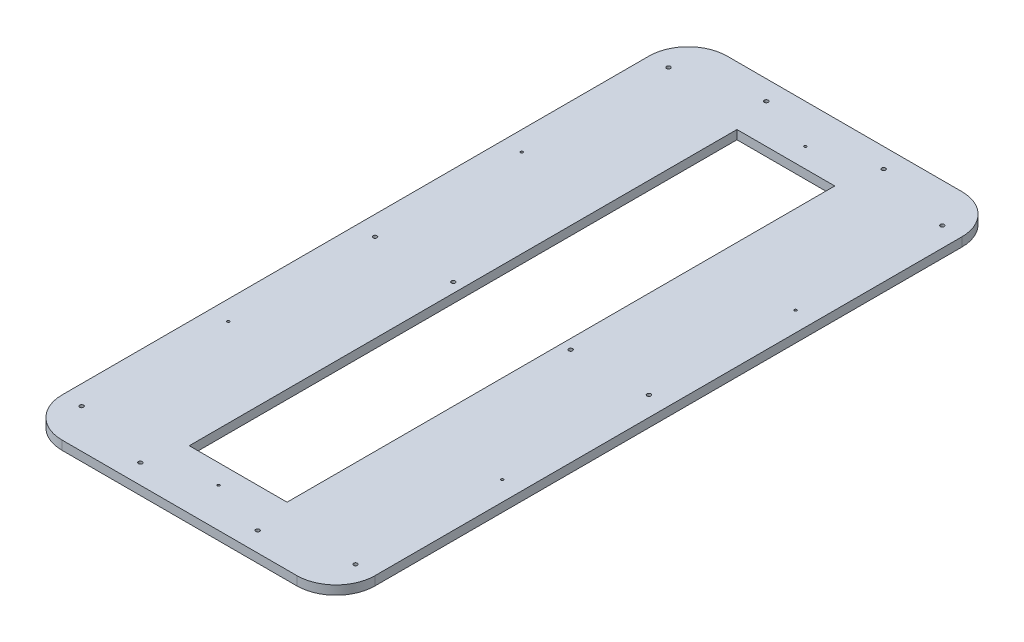
ISO-10303-21;
HEADER;
FILE_DESCRIPTION(('STEP AP214'),'2;1');
FILE_NAME('part.step','',(''),(''),'','','');
FILE_SCHEMA(('AUTOMOTIVE_DESIGN { 1 0 10303 214 1 1 1 1 }'));
ENDSEC;
DATA;
#1=APPLICATION_CONTEXT('core data for automotive mechanical design processes');
#2=APPLICATION_PROTOCOL_DEFINITION('international standard','automotive_design',2000,#1);
#3=PRODUCT_CONTEXT('',#1,'mechanical');
#4=PRODUCT('Part','Part','',(#3));
#5=PRODUCT_RELATED_PRODUCT_CATEGORY('part','',(#4));
#6=PRODUCT_DEFINITION_FORMATION('','',#4);
#7=PRODUCT_DEFINITION_CONTEXT('part definition',#1,'design');
#8=PRODUCT_DEFINITION('design','',#6,#7);
#9=PRODUCT_DEFINITION_SHAPE('','',#8);
#10=(LENGTH_UNIT() NAMED_UNIT(*) SI_UNIT(.MILLI.,.METRE.));
#11=(NAMED_UNIT(*) PLANE_ANGLE_UNIT() SI_UNIT($,.RADIAN.));
#12=(NAMED_UNIT(*) SI_UNIT($,.STERADIAN.) SOLID_ANGLE_UNIT());
#13=UNCERTAINTY_MEASURE_WITH_UNIT(LENGTH_MEASURE(1.E-05),#10,'distance_accuracy_value','');
#14=(GEOMETRIC_REPRESENTATION_CONTEXT(3) GLOBAL_UNCERTAINTY_ASSIGNED_CONTEXT((#13)) GLOBAL_UNIT_ASSIGNED_CONTEXT((#10,
#11,#12)) REPRESENTATION_CONTEXT('',''));
#15=CARTESIAN_POINT('',(0.,0.,0.));
#16=DIRECTION('',(0.,0.,1.));
#17=DIRECTION('',(1.,0.,0.));
#18=AXIS2_PLACEMENT_3D('',#15,#16,#17);
#19=CARTESIAN_POINT('',(0.,5.8,0.));
#20=DIRECTION('',(1.,0.,0.));
#21=DIRECTION('',(0.,0.,-1.));
#22=AXIS2_PLACEMENT_3D('',#19,#20,#21);
#23=PLANE('',#22);
#24=DIRECTION('',(0.,0.,1.));
#25=VECTOR('',#24,1.);
#26=CARTESIAN_POINT('',(0.,5.8,0.));
#27=LINE('',#26,#25);
#28=CARTESIAN_POINT('',(0.,5.8,-406.4));
#29=VERTEX_POINT('',#28);
#30=CARTESIAN_POINT('',(0.,5.8,-25.4));
#31=VERTEX_POINT('',#30);
#32=EDGE_CURVE('E197',#29,#31,#27,.T.);
#33=ORIENTED_EDGE('',*,*,#32,.F.);
#34=DIRECTION('',(0.,-1.,0.));
#35=VECTOR('',#34,1.);
#36=CARTESIAN_POINT('',(0.,5.8,-406.4));
#37=LINE('',#36,#35);
#38=CARTESIAN_POINT('',(0.,0.,-406.4));
#39=VERTEX_POINT('',#38);
#40=EDGE_CURVE('E254',#29,#39,#37,.T.);
#41=ORIENTED_EDGE('',*,*,#40,.T.);
#42=DIRECTION('',(0.,0.,1.));
#43=VECTOR('',#42,1.);
#44=CARTESIAN_POINT('',(0.,0.,0.));
#45=LINE('',#44,#43);
#46=CARTESIAN_POINT('',(0.,0.,-25.4));
#47=VERTEX_POINT('',#46);
#48=EDGE_CURVE('E196',#39,#47,#45,.T.);
#49=ORIENTED_EDGE('',*,*,#48,.T.);
#50=DIRECTION('',(0.,-1.,0.));
#51=VECTOR('',#50,1.);
#52=CARTESIAN_POINT('',(0.,5.8,-25.4));
#53=LINE('',#52,#51);
#54=EDGE_CURVE('E252',#47,#31,#53,.F.);
#55=ORIENTED_EDGE('',*,*,#54,.T.);
#56=EDGE_LOOP('',(#33,#41,#49,#55));
#57=FACE_BOUND('',#56,.T.);
#58=ADVANCED_FACE('F32',(#57),#23,.F.);
#59=CARTESIAN_POINT('',(0.,5.8,0.));
#60=DIRECTION('',(0.,0.,-1.));
#61=DIRECTION('',(-1.,0.,0.));
#62=AXIS2_PLACEMENT_3D('',#59,#60,#61);
#63=PLANE('',#62);
#64=DIRECTION('',(1.,0.,0.));
#65=VECTOR('',#64,1.);
#66=CARTESIAN_POINT('',(0.,0.,0.));
#67=LINE('',#66,#65);
#68=CARTESIAN_POINT('',(25.4,0.,0.));
#69=VERTEX_POINT('',#68);
#70=CARTESIAN_POINT('',(177.8,0.,0.));
#71=VERTEX_POINT('',#70);
#72=EDGE_CURVE('E211',#69,#71,#67,.T.);
#73=ORIENTED_EDGE('',*,*,#72,.T.);
#74=DIRECTION('',(0.,-1.,0.));
#75=VECTOR('',#74,1.);
#76=CARTESIAN_POINT('',(177.8,5.8,0.));
#77=LINE('',#76,#75);
#78=CARTESIAN_POINT('',(177.8,5.8,0.));
#79=VERTEX_POINT('',#78);
#80=EDGE_CURVE('E11',#71,#79,#77,.F.);
#81=ORIENTED_EDGE('',*,*,#80,.T.);
#82=DIRECTION('',(1.,0.,0.));
#83=VECTOR('',#82,1.);
#84=CARTESIAN_POINT('',(0.,5.8,0.));
#85=LINE('',#84,#83);
#86=CARTESIAN_POINT('',(25.4,5.8,0.));
#87=VERTEX_POINT('',#86);
#88=EDGE_CURVE('E199',#87,#79,#85,.T.);
#89=ORIENTED_EDGE('',*,*,#88,.F.);
#90=DIRECTION('',(0.,-1.,0.));
#91=VECTOR('',#90,1.);
#92=CARTESIAN_POINT('',(25.4,5.8,0.));
#93=LINE('',#92,#91);
#94=EDGE_CURVE('E41',#87,#69,#93,.T.);
#95=ORIENTED_EDGE('',*,*,#94,.T.);
#96=EDGE_LOOP('',(#73,#81,#89,#95));
#97=FACE_BOUND('',#96,.T.);
#98=ADVANCED_FACE('F342',(#97),#63,.F.);
#99=CARTESIAN_POINT('',(203.2,5.8,0.));
#100=DIRECTION('',(-1.,0.,0.));
#101=DIRECTION('',(0.,0.,1.));
#102=AXIS2_PLACEMENT_3D('',#99,#100,#101);
#103=PLANE('',#102);
#104=DIRECTION('',(0.,0.,-1.));
#105=VECTOR('',#104,1.);
#106=CARTESIAN_POINT('',(203.2,0.,0.));
#107=LINE('',#106,#105);
#108=CARTESIAN_POINT('',(203.2,0.,-25.4));
#109=VERTEX_POINT('',#108);
#110=CARTESIAN_POINT('',(203.2,0.,-406.4));
#111=VERTEX_POINT('',#110);
#112=EDGE_CURVE('E213',#109,#111,#107,.T.);
#113=ORIENTED_EDGE('',*,*,#112,.T.);
#114=DIRECTION('',(0.,-1.,0.));
#115=VECTOR('',#114,1.);
#116=CARTESIAN_POINT('',(203.2,5.8,-406.4));
#117=LINE('',#116,#115);
#118=CARTESIAN_POINT('',(203.2,5.8,-406.4));
#119=VERTEX_POINT('',#118);
#120=EDGE_CURVE('E243',#111,#119,#117,.F.);
#121=ORIENTED_EDGE('',*,*,#120,.T.);
#122=DIRECTION('',(0.,0.,-1.));
#123=VECTOR('',#122,1.);
#124=CARTESIAN_POINT('',(203.2,5.8,0.));
#125=LINE('',#124,#123);
#126=CARTESIAN_POINT('',(203.2,5.8,-25.4));
#127=VERTEX_POINT('',#126);
#128=EDGE_CURVE('E202',#127,#119,#125,.T.);
#129=ORIENTED_EDGE('',*,*,#128,.F.);
#130=DIRECTION('',(0.,-1.,0.));
#131=VECTOR('',#130,1.);
#132=CARTESIAN_POINT('',(203.2,5.8,-25.4));
#133=LINE('',#132,#131);
#134=EDGE_CURVE('E240',#127,#109,#133,.T.);
#135=ORIENTED_EDGE('',*,*,#134,.T.);
#136=EDGE_LOOP('',(#113,#121,#129,#135));
#137=FACE_BOUND('',#136,.T.);
#138=ADVANCED_FACE('F345',(#137),#103,.F.);
#139=CARTESIAN_POINT('',(0.,5.8,-431.8));
#140=DIRECTION('',(0.,0.,1.));
#141=DIRECTION('',(1.,0.,0.));
#142=AXIS2_PLACEMENT_3D('',#139,#140,#141);
#143=PLANE('',#142);
#144=DIRECTION('',(-1.,0.,0.));
#145=VECTOR('',#144,1.);
#146=CARTESIAN_POINT('',(0.,5.8,-431.8));
#147=LINE('',#146,#145);
#148=CARTESIAN_POINT('',(177.8,5.8,-431.8));
#149=VERTEX_POINT('',#148);
#150=CARTESIAN_POINT('',(25.4,5.8,-431.8));
#151=VERTEX_POINT('',#150);
#152=EDGE_CURVE('E205',#149,#151,#147,.T.);
#153=ORIENTED_EDGE('',*,*,#152,.F.);
#154=DIRECTION('',(0.,-1.,0.));
#155=VECTOR('',#154,1.);
#156=CARTESIAN_POINT('',(177.8,5.8,-431.8));
#157=LINE('',#156,#155);
#158=CARTESIAN_POINT('',(177.8,0.,-431.8));
#159=VERTEX_POINT('',#158);
#160=EDGE_CURVE('E229',#149,#159,#157,.T.);
#161=ORIENTED_EDGE('',*,*,#160,.T.);
#162=DIRECTION('',(-1.,0.,0.));
#163=VECTOR('',#162,1.);
#164=CARTESIAN_POINT('',(0.,0.,-431.8));
#165=LINE('',#164,#163);
#166=CARTESIAN_POINT('',(25.4,0.,-431.8));
#167=VERTEX_POINT('',#166);
#168=EDGE_CURVE('E200',#159,#167,#165,.T.);
#169=ORIENTED_EDGE('',*,*,#168,.T.);
#170=DIRECTION('',(0.,-1.,0.));
#171=VECTOR('',#170,1.);
#172=CARTESIAN_POINT('',(25.4,5.8,-431.8));
#173=LINE('',#172,#171);
#174=EDGE_CURVE('E208',#167,#151,#173,.F.);
#175=ORIENTED_EDGE('',*,*,#174,.T.);
#176=EDGE_LOOP('',(#153,#161,#169,#175));
#177=FACE_BOUND('',#176,.T.);
#178=ADVANCED_FACE('F297',(#177),#143,.F.);
#179=CARTESIAN_POINT('',(0.,5.8,-431.8));
#180=DIRECTION('',(0.,-1.,0.));
#181=DIRECTION('',(0.,0.,-1.));
#182=AXIS2_PLACEMENT_3D('',#179,#180,#181);
#183=PLANE('',#182);
#184=CARTESIAN_POINT('',(12.7,5.8,-120.65));
#185=DIRECTION('',(0.,1.,0.));
#186=DIRECTION('',(0.,0.,-1.));
#187=AXIS2_PLACEMENT_3D('',#184,#185,#186);
#188=CIRCLE('',#187,0.793750000000006);
#189=CARTESIAN_POINT('',(12.7,5.8,-121.44375));
#190=VERTEX_POINT('',#189);
#191=EDGE_CURVE('E502',#190,#190,#188,.T.);
#192=ORIENTED_EDGE('',*,*,#191,.F.);
#193=EDGE_LOOP('',(#192));
#194=FACE_BOUND('',#193,.T.);
#195=CARTESIAN_POINT('',(190.5,5.8,-120.65));
#196=DIRECTION('',(0.,1.,0.));
#197=DIRECTION('',(0.,0.,-1.));
#198=AXIS2_PLACEMENT_3D('',#195,#196,#197);
#199=CIRCLE('',#198,0.79375000000005);
#200=CARTESIAN_POINT('',(190.5,5.8,-121.44375));
#201=VERTEX_POINT('',#200);
#202=EDGE_CURVE('E504',#201,#201,#199,.T.);
#203=ORIENTED_EDGE('',*,*,#202,.F.);
#204=EDGE_LOOP('',(#203));
#205=FACE_BOUND('',#204,.T.);
#206=CARTESIAN_POINT('',(101.6,5.8,-25.3999999999998));
#207=DIRECTION('',(0.,1.,0.));
#208=DIRECTION('',(0.,0.,-1.));
#209=AXIS2_PLACEMENT_3D('',#206,#207,#208);
#210=CIRCLE('',#209,0.793749999999978);
#211=CARTESIAN_POINT('',(101.6,5.8,-26.1937499999998));
#212=VERTEX_POINT('',#211);
#213=EDGE_CURVE('E508',#212,#212,#210,.T.);
#214=ORIENTED_EDGE('',*,*,#213,.F.);
#215=EDGE_LOOP('',(#214));
#216=FACE_BOUND('',#215,.T.);
#217=CARTESIAN_POINT('',(101.6,5.8,-406.4));
#218=DIRECTION('',(0.,1.,0.));
#219=DIRECTION('',(0.,0.,1.));
#220=AXIS2_PLACEMENT_3D('',#217,#218,#219);
#221=CIRCLE('',#220,0.793749999999971);
#222=CARTESIAN_POINT('',(101.6,5.8,-405.60625));
#223=VERTEX_POINT('',#222);
#224=EDGE_CURVE('E512',#223,#223,#221,.T.);
#225=ORIENTED_EDGE('',*,*,#224,.F.);
#226=EDGE_LOOP('',(#225));
#227=FACE_BOUND('',#226,.T.);
#228=CARTESIAN_POINT('',(190.5,5.8,-311.15));
#229=DIRECTION('',(0.,1.,0.));
#230=DIRECTION('',(0.,0.,1.));
#231=AXIS2_PLACEMENT_3D('',#228,#229,#230);
#232=CIRCLE('',#231,0.79375000000008);
#233=CARTESIAN_POINT('',(190.5,5.8,-310.35625));
#234=VERTEX_POINT('',#233);
#235=EDGE_CURVE('E516',#234,#234,#232,.T.);
#236=ORIENTED_EDGE('',*,*,#235,.F.);
#237=EDGE_LOOP('',(#236));
#238=FACE_BOUND('',#237,.T.);
#239=CARTESIAN_POINT('',(12.7,5.8,-311.15));
#240=DIRECTION('',(0.,1.,0.));
#241=DIRECTION('',(0.,0.,1.));
#242=AXIS2_PLACEMENT_3D('',#239,#240,#241);
#243=CIRCLE('',#242,0.793750000000026);
#244=CARTESIAN_POINT('',(12.7,5.8,-310.35625));
#245=VERTEX_POINT('',#244);
#246=EDGE_CURVE('E520',#245,#245,#243,.T.);
#247=ORIENTED_EDGE('',*,*,#246,.F.);
#248=EDGE_LOOP('',(#247));
#249=FACE_BOUND('',#248,.T.);
#250=CARTESIAN_POINT('',(190.5,5.8,-406.4));
#251=DIRECTION('',(0.,1.,0.));
#252=DIRECTION('',(0.,0.,1.));
#253=AXIS2_PLACEMENT_3D('',#250,#251,#252);
#254=CIRCLE('',#253,1.25);
#255=CARTESIAN_POINT('',(190.5,5.8,-405.15));
#256=VERTEX_POINT('',#255);
#257=EDGE_CURVE('E284',#256,#256,#254,.T.);
#258=ORIENTED_EDGE('',*,*,#257,.F.);
#259=EDGE_LOOP('',(#258));
#260=FACE_BOUND('',#259,.T.);
#261=CARTESIAN_POINT('',(190.5,5.8,-25.4));
#262=DIRECTION('',(0.,1.,0.));
#263=DIRECTION('',(0.,0.,1.));
#264=AXIS2_PLACEMENT_3D('',#261,#262,#263);
#265=CIRCLE('',#264,1.25);
#266=CARTESIAN_POINT('',(190.5,5.8,-24.15));
#267=VERTEX_POINT('',#266);
#268=EDGE_CURVE('E274',#267,#267,#265,.T.);
#269=ORIENTED_EDGE('',*,*,#268,.F.);
#270=EDGE_LOOP('',(#269));
#271=FACE_BOUND('',#270,.T.);
#272=CARTESIAN_POINT('',(12.7,5.8,-25.4));
#273=DIRECTION('',(0.,1.,0.));
#274=DIRECTION('',(0.,0.,1.));
#275=AXIS2_PLACEMENT_3D('',#272,#273,#274);
#276=CIRCLE('',#275,1.25);
#277=CARTESIAN_POINT('',(12.7,5.8,-24.15));
#278=VERTEX_POINT('',#277);
#279=EDGE_CURVE('E271',#278,#278,#276,.T.);
#280=ORIENTED_EDGE('',*,*,#279,.F.);
#281=EDGE_LOOP('',(#280));
#282=FACE_BOUND('',#281,.T.);
#283=CARTESIAN_POINT('',(12.7,5.8,-406.4));
#284=DIRECTION('',(0.,1.,0.));
#285=DIRECTION('',(0.,0.,1.));
#286=AXIS2_PLACEMENT_3D('',#283,#284,#285);
#287=CIRCLE('',#286,1.25);
#288=CARTESIAN_POINT('',(12.7,5.8,-405.15));
#289=VERTEX_POINT('',#288);
#290=EDGE_CURVE('E268',#289,#289,#287,.T.);
#291=ORIENTED_EDGE('',*,*,#290,.F.);
#292=EDGE_LOOP('',(#291));
#293=FACE_BOUND('',#292,.T.);
#294=CARTESIAN_POINT('',(190.5,5.8,-215.9));
#295=DIRECTION('',(0.,1.,0.));
#296=DIRECTION('',(0.,0.,1.));
#297=AXIS2_PLACEMENT_3D('',#294,#295,#296);
#298=CIRCLE('',#297,1.25);
#299=CARTESIAN_POINT('',(190.5,5.8,-214.65));
#300=VERTEX_POINT('',#299);
#301=EDGE_CURVE('E264',#300,#300,#298,.T.);
#302=ORIENTED_EDGE('',*,*,#301,.F.);
#303=EDGE_LOOP('',(#302));
#304=FACE_BOUND('',#303,.T.);
#305=CARTESIAN_POINT('',(12.7,5.8,-215.9));
#306=DIRECTION('',(0.,1.,0.));
#307=DIRECTION('',(0.,0.,1.));
#308=AXIS2_PLACEMENT_3D('',#305,#306,#307);
#309=CIRCLE('',#308,1.25);
#310=CARTESIAN_POINT('',(12.7,5.8,-214.65));
#311=VERTEX_POINT('',#310);
#312=EDGE_CURVE('E154',#311,#311,#309,.T.);
#313=ORIENTED_EDGE('',*,*,#312,.F.);
#314=EDGE_LOOP('',(#313));
#315=FACE_BOUND('',#314,.T.);
#316=DIRECTION('',(1.,0.,0.));
#317=VECTOR('',#316,1.);
#318=CARTESIAN_POINT('',(69.85,5.8,-38.1));
#319=LINE('',#318,#317);
#320=CARTESIAN_POINT('',(69.85,5.8,-38.1));
#321=VERTEX_POINT('',#320);
#322=CARTESIAN_POINT('',(133.35,5.8,-38.1));
#323=VERTEX_POINT('',#322);
#324=EDGE_CURVE('E160',#321,#323,#319,.T.);
#325=ORIENTED_EDGE('',*,*,#324,.F.);
#326=DIRECTION('',(0.,0.,1.));
#327=VECTOR('',#326,1.);
#328=CARTESIAN_POINT('',(69.85,5.8,-393.7));
#329=LINE('',#328,#327);
#330=CARTESIAN_POINT('',(69.85,5.8,-393.7));
#331=VERTEX_POINT('',#330);
#332=EDGE_CURVE('E130',#331,#321,#329,.T.);
#333=ORIENTED_EDGE('',*,*,#332,.F.);
#334=DIRECTION('',(-1.,0.,0.));
#335=VECTOR('',#334,1.);
#336=CARTESIAN_POINT('',(69.85,5.8,-393.7));
#337=LINE('',#336,#335);
#338=CARTESIAN_POINT('',(133.35,5.8,-393.7));
#339=VERTEX_POINT('',#338);
#340=EDGE_CURVE('E148',#339,#331,#337,.T.);
#341=ORIENTED_EDGE('',*,*,#340,.F.);
#342=DIRECTION('',(0.,0.,-1.));
#343=VECTOR('',#342,1.);
#344=CARTESIAN_POINT('',(133.35,5.8,-393.7));
#345=LINE('',#344,#343);
#346=EDGE_CURVE('E151',#323,#339,#345,.T.);
#347=ORIENTED_EDGE('',*,*,#346,.F.);
#348=EDGE_LOOP('',(#325,#333,#341,#347));
#349=FACE_BOUND('',#348,.T.);
#350=CARTESIAN_POINT('',(63.5,5.8,-419.1));
#351=DIRECTION('',(0.,1.,0.));
#352=DIRECTION('',(0.,0.,1.));
#353=AXIS2_PLACEMENT_3D('',#350,#351,#352);
#354=CIRCLE('',#353,1.24999999999999);
#355=CARTESIAN_POINT('',(63.5,5.8,-417.85));
#356=VERTEX_POINT('',#355);
#357=EDGE_CURVE('E167',#356,#356,#354,.T.);
#358=ORIENTED_EDGE('',*,*,#357,.F.);
#359=EDGE_LOOP('',(#358));
#360=FACE_BOUND('',#359,.T.);
#361=CARTESIAN_POINT('',(139.7,5.8,-419.1));
#362=DIRECTION('',(0.,1.,0.));
#363=DIRECTION('',(0.,0.,1.));
#364=AXIS2_PLACEMENT_3D('',#361,#362,#363);
#365=CIRCLE('',#364,1.25);
#366=CARTESIAN_POINT('',(139.7,5.8,-417.85));
#367=VERTEX_POINT('',#366);
#368=EDGE_CURVE('E174',#367,#367,#365,.T.);
#369=ORIENTED_EDGE('',*,*,#368,.F.);
#370=EDGE_LOOP('',(#369));
#371=FACE_BOUND('',#370,.T.);
#372=CARTESIAN_POINT('',(63.5,5.8,-215.9));
#373=DIRECTION('',(0.,1.,0.));
#374=DIRECTION('',(0.,0.,1.));
#375=AXIS2_PLACEMENT_3D('',#372,#373,#374);
#376=CIRCLE('',#375,1.24999999999999);
#377=CARTESIAN_POINT('',(63.5,5.8,-214.65));
#378=VERTEX_POINT('',#377);
#379=EDGE_CURVE('E178',#378,#378,#376,.T.);
#380=ORIENTED_EDGE('',*,*,#379,.F.);
#381=EDGE_LOOP('',(#380));
#382=FACE_BOUND('',#381,.T.);
#383=CARTESIAN_POINT('',(139.7,5.8,-215.9));
#384=DIRECTION('',(0.,1.,0.));
#385=DIRECTION('',(0.,0.,1.));
#386=AXIS2_PLACEMENT_3D('',#383,#384,#385);
#387=CIRCLE('',#386,1.25);
#388=CARTESIAN_POINT('',(139.7,5.8,-214.65));
#389=VERTEX_POINT('',#388);
#390=EDGE_CURVE('E182',#389,#389,#387,.T.);
#391=ORIENTED_EDGE('',*,*,#390,.F.);
#392=EDGE_LOOP('',(#391));
#393=FACE_BOUND('',#392,.T.);
#394=CARTESIAN_POINT('',(63.5,5.8,-12.7));
#395=DIRECTION('',(0.,1.,0.));
#396=DIRECTION('',(0.,0.,1.));
#397=AXIS2_PLACEMENT_3D('',#394,#395,#396);
#398=CIRCLE('',#397,1.24999999999999);
#399=CARTESIAN_POINT('',(63.5,5.8,-11.45));
#400=VERTEX_POINT('',#399);
#401=EDGE_CURVE('E186',#400,#400,#398,.T.);
#402=ORIENTED_EDGE('',*,*,#401,.F.);
#403=EDGE_LOOP('',(#402));
#404=FACE_BOUND('',#403,.T.);
#405=CARTESIAN_POINT('',(139.7,5.8,-12.7));
#406=DIRECTION('',(0.,1.,0.));
#407=DIRECTION('',(0.,0.,1.));
#408=AXIS2_PLACEMENT_3D('',#405,#406,#407);
#409=CIRCLE('',#408,1.25);
#410=CARTESIAN_POINT('',(139.7,5.8,-11.45));
#411=VERTEX_POINT('',#410);
#412=EDGE_CURVE('E190',#411,#411,#409,.T.);
#413=ORIENTED_EDGE('',*,*,#412,.F.);
#414=EDGE_LOOP('',(#413));
#415=FACE_BOUND('',#414,.T.);
#416=ORIENTED_EDGE('',*,*,#128,.T.);
#417=CARTESIAN_POINT('',(177.8,5.8,-406.4));
#418=DIRECTION('',(0.,-1.,0.));
#419=DIRECTION('',(0.,0.,-1.));
#420=AXIS2_PLACEMENT_3D('',#417,#418,#419);
#421=CIRCLE('',#420,25.4);
#422=EDGE_CURVE('E250',#119,#149,#421,.F.);
#423=ORIENTED_EDGE('',*,*,#422,.T.);
#424=ORIENTED_EDGE('',*,*,#152,.T.);
#425=CARTESIAN_POINT('',(25.4,5.8,-406.4));
#426=DIRECTION('',(0.,-1.,0.));
#427=DIRECTION('',(0.,0.,-1.));
#428=AXIS2_PLACEMENT_3D('',#425,#426,#427);
#429=CIRCLE('',#428,25.4);
#430=EDGE_CURVE('E248',#151,#29,#429,.F.);
#431=ORIENTED_EDGE('',*,*,#430,.T.);
#432=ORIENTED_EDGE('',*,*,#32,.T.);
#433=CARTESIAN_POINT('',(25.4,5.8,-25.4));
#434=DIRECTION('',(0.,-1.,0.));
#435=DIRECTION('',(0.,0.,-1.));
#436=AXIS2_PLACEMENT_3D('',#433,#434,#435);
#437=CIRCLE('',#436,25.4);
#438=EDGE_CURVE('E54',#31,#87,#437,.F.);
#439=ORIENTED_EDGE('',*,*,#438,.T.);
#440=ORIENTED_EDGE('',*,*,#88,.T.);
#441=CARTESIAN_POINT('',(177.8,5.8,-25.4));
#442=DIRECTION('',(0.,-1.,0.));
#443=DIRECTION('',(0.,0.,-1.));
#444=AXIS2_PLACEMENT_3D('',#441,#442,#443);
#445=CIRCLE('',#444,25.4);
#446=EDGE_CURVE('E246',#79,#127,#445,.F.);
#447=ORIENTED_EDGE('',*,*,#446,.T.);
#448=EDGE_LOOP('',(#416,#423,#424,#431,#432,#439,#440,#447));
#449=FACE_BOUND('',#448,.T.);
#450=ADVANCED_FACE('F294',(#194,#205,#216,#227,#238,#249,#260,#271,#282,#293,#304,#315,#349,
#360,#371,#382,#393,#404,#415,#449),#183,.F.);
#451=CARTESIAN_POINT('',(0.,0.,-431.8));
#452=DIRECTION('',(0.,-1.,0.));
#453=DIRECTION('',(0.,0.,-1.));
#454=AXIS2_PLACEMENT_3D('',#451,#452,#453);
#455=PLANE('',#454);
#456=CARTESIAN_POINT('',(12.7,0.,-120.65));
#457=DIRECTION('',(0.,1.,0.));
#458=DIRECTION('',(0.,0.,-1.));
#459=AXIS2_PLACEMENT_3D('',#456,#457,#458);
#460=CIRCLE('',#459,0.793750000000006);
#461=CARTESIAN_POINT('',(12.7,0.,-121.44375));
#462=VERTEX_POINT('',#461);
#463=EDGE_CURVE('E424',#462,#462,#460,.T.);
#464=ORIENTED_EDGE('',*,*,#463,.T.);
#465=EDGE_LOOP('',(#464));
#466=FACE_BOUND('',#465,.T.);
#467=CARTESIAN_POINT('',(190.5,0.,-120.65));
#468=DIRECTION('',(0.,1.,0.));
#469=DIRECTION('',(0.,0.,-1.));
#470=AXIS2_PLACEMENT_3D('',#467,#468,#469);
#471=CIRCLE('',#470,0.79375000000005);
#472=CARTESIAN_POINT('',(190.5,0.,-121.44375));
#473=VERTEX_POINT('',#472);
#474=EDGE_CURVE('E428',#473,#473,#471,.T.);
#475=ORIENTED_EDGE('',*,*,#474,.T.);
#476=EDGE_LOOP('',(#475));
#477=FACE_BOUND('',#476,.T.);
#478=CARTESIAN_POINT('',(101.6,0.,-25.3999999999998));
#479=DIRECTION('',(0.,1.,0.));
#480=DIRECTION('',(0.,0.,-1.));
#481=AXIS2_PLACEMENT_3D('',#478,#479,#480);
#482=CIRCLE('',#481,0.793749999999978);
#483=CARTESIAN_POINT('',(101.6,0.,-26.1937499999998));
#484=VERTEX_POINT('',#483);
#485=EDGE_CURVE('E432',#484,#484,#482,.T.);
#486=ORIENTED_EDGE('',*,*,#485,.T.);
#487=EDGE_LOOP('',(#486));
#488=FACE_BOUND('',#487,.T.);
#489=CARTESIAN_POINT('',(101.6,0.,-406.4));
#490=DIRECTION('',(0.,1.,0.));
#491=DIRECTION('',(0.,0.,1.));
#492=AXIS2_PLACEMENT_3D('',#489,#490,#491);
#493=CIRCLE('',#492,0.793749999999971);
#494=CARTESIAN_POINT('',(101.6,0.,-405.60625));
#495=VERTEX_POINT('',#494);
#496=EDGE_CURVE('E436',#495,#495,#493,.T.);
#497=ORIENTED_EDGE('',*,*,#496,.T.);
#498=EDGE_LOOP('',(#497));
#499=FACE_BOUND('',#498,.T.);
#500=CARTESIAN_POINT('',(190.5,0.,-311.15));
#501=DIRECTION('',(0.,1.,0.));
#502=DIRECTION('',(0.,0.,1.));
#503=AXIS2_PLACEMENT_3D('',#500,#501,#502);
#504=CIRCLE('',#503,0.79375000000008);
#505=CARTESIAN_POINT('',(190.5,0.,-310.35625));
#506=VERTEX_POINT('',#505);
#507=EDGE_CURVE('E440',#506,#506,#504,.T.);
#508=ORIENTED_EDGE('',*,*,#507,.T.);
#509=EDGE_LOOP('',(#508));
#510=FACE_BOUND('',#509,.T.);
#511=CARTESIAN_POINT('',(12.7,0.,-311.15));
#512=DIRECTION('',(0.,1.,0.));
#513=DIRECTION('',(0.,0.,1.));
#514=AXIS2_PLACEMENT_3D('',#511,#512,#513);
#515=CIRCLE('',#514,0.793750000000026);
#516=CARTESIAN_POINT('',(12.7,0.,-310.35625));
#517=VERTEX_POINT('',#516);
#518=EDGE_CURVE('E444',#517,#517,#515,.T.);
#519=ORIENTED_EDGE('',*,*,#518,.T.);
#520=EDGE_LOOP('',(#519));
#521=FACE_BOUND('',#520,.T.);
#522=CARTESIAN_POINT('',(190.5,0.,-406.4));
#523=DIRECTION('',(0.,-1.,0.));
#524=DIRECTION('',(0.,0.,-1.));
#525=AXIS2_PLACEMENT_3D('',#522,#523,#524);
#526=CIRCLE('',#525,1.25);
#527=CARTESIAN_POINT('',(190.5,0.,-407.65));
#528=VERTEX_POINT('',#527);
#529=EDGE_CURVE('E36',#528,#528,#526,.T.);
#530=ORIENTED_EDGE('',*,*,#529,.F.);
#531=EDGE_LOOP('',(#530));
#532=FACE_BOUND('',#531,.T.);
#533=CARTESIAN_POINT('',(190.5,0.,-25.4));
#534=DIRECTION('',(0.,-1.,0.));
#535=DIRECTION('',(0.,0.,-1.));
#536=AXIS2_PLACEMENT_3D('',#533,#534,#535);
#537=CIRCLE('',#536,1.25);
#538=CARTESIAN_POINT('',(190.5,0.,-26.65));
#539=VERTEX_POINT('',#538);
#540=EDGE_CURVE('E272',#539,#539,#537,.T.);
#541=ORIENTED_EDGE('',*,*,#540,.F.);
#542=EDGE_LOOP('',(#541));
#543=FACE_BOUND('',#542,.T.);
#544=CARTESIAN_POINT('',(12.7,0.,-25.4));
#545=DIRECTION('',(0.,-1.,0.));
#546=DIRECTION('',(0.,0.,-1.));
#547=AXIS2_PLACEMENT_3D('',#544,#545,#546);
#548=CIRCLE('',#547,1.25);
#549=CARTESIAN_POINT('',(12.7,0.,-26.65));
#550=VERTEX_POINT('',#549);
#551=EDGE_CURVE('E269',#550,#550,#548,.T.);
#552=ORIENTED_EDGE('',*,*,#551,.F.);
#553=EDGE_LOOP('',(#552));
#554=FACE_BOUND('',#553,.T.);
#555=CARTESIAN_POINT('',(12.7,0.,-406.4));
#556=DIRECTION('',(0.,-1.,0.));
#557=DIRECTION('',(0.,0.,-1.));
#558=AXIS2_PLACEMENT_3D('',#555,#556,#557);
#559=CIRCLE('',#558,1.25);
#560=CARTESIAN_POINT('',(12.7,0.,-407.65));
#561=VERTEX_POINT('',#560);
#562=EDGE_CURVE('E265',#561,#561,#559,.T.);
#563=ORIENTED_EDGE('',*,*,#562,.F.);
#564=EDGE_LOOP('',(#563));
#565=FACE_BOUND('',#564,.T.);
#566=CARTESIAN_POINT('',(190.5,0.,-215.9));
#567=DIRECTION('',(0.,-1.,0.));
#568=DIRECTION('',(0.,0.,-1.));
#569=AXIS2_PLACEMENT_3D('',#566,#567,#568);
#570=CIRCLE('',#569,1.25);
#571=CARTESIAN_POINT('',(190.5,0.,-217.15));
#572=VERTEX_POINT('',#571);
#573=EDGE_CURVE('E261',#572,#572,#570,.T.);
#574=ORIENTED_EDGE('',*,*,#573,.F.);
#575=EDGE_LOOP('',(#574));
#576=FACE_BOUND('',#575,.T.);
#577=CARTESIAN_POINT('',(12.7,0.,-215.9));
#578=DIRECTION('',(0.,-1.,0.));
#579=DIRECTION('',(0.,0.,-1.));
#580=AXIS2_PLACEMENT_3D('',#577,#578,#579);
#581=CIRCLE('',#580,1.25);
#582=CARTESIAN_POINT('',(12.7,0.,-217.15));
#583=VERTEX_POINT('',#582);
#584=EDGE_CURVE('E161',#583,#583,#581,.T.);
#585=ORIENTED_EDGE('',*,*,#584,.F.);
#586=EDGE_LOOP('',(#585));
#587=FACE_BOUND('',#586,.T.);
#588=DIRECTION('',(0.,0.,1.));
#589=VECTOR('',#588,1.);
#590=CARTESIAN_POINT('',(69.85,0.,-393.7));
#591=LINE('',#590,#589);
#592=CARTESIAN_POINT('',(69.85,0.,-393.7));
#593=VERTEX_POINT('',#592);
#594=CARTESIAN_POINT('',(69.85,0.,-38.1));
#595=VERTEX_POINT('',#594);
#596=EDGE_CURVE('E127',#593,#595,#591,.T.);
#597=ORIENTED_EDGE('',*,*,#596,.T.);
#598=DIRECTION('',(1.,0.,0.));
#599=VECTOR('',#598,1.);
#600=CARTESIAN_POINT('',(69.85,0.,-38.1));
#601=LINE('',#600,#599);
#602=CARTESIAN_POINT('',(133.35,0.,-38.1));
#603=VERTEX_POINT('',#602);
#604=EDGE_CURVE('E139',#595,#603,#601,.T.);
#605=ORIENTED_EDGE('',*,*,#604,.T.);
#606=DIRECTION('',(0.,0.,-1.));
#607=VECTOR('',#606,1.);
#608=CARTESIAN_POINT('',(133.35,0.,-393.7));
#609=LINE('',#608,#607);
#610=CARTESIAN_POINT('',(133.35,0.,-393.7));
#611=VERTEX_POINT('',#610);
#612=EDGE_CURVE('E143',#603,#611,#609,.T.);
#613=ORIENTED_EDGE('',*,*,#612,.T.);
#614=DIRECTION('',(-1.,0.,0.));
#615=VECTOR('',#614,1.);
#616=CARTESIAN_POINT('',(69.85,0.,-393.7));
#617=LINE('',#616,#615);
#618=EDGE_CURVE('E135',#611,#593,#617,.T.);
#619=ORIENTED_EDGE('',*,*,#618,.T.);
#620=EDGE_LOOP('',(#597,#605,#613,#619));
#621=FACE_BOUND('',#620,.T.);
#622=CARTESIAN_POINT('',(63.5,0.,-419.1));
#623=DIRECTION('',(0.,-1.,0.));
#624=DIRECTION('',(0.,0.,-1.));
#625=AXIS2_PLACEMENT_3D('',#622,#623,#624);
#626=CIRCLE('',#625,1.24999999999999);
#627=CARTESIAN_POINT('',(63.5,0.,-420.35));
#628=VERTEX_POINT('',#627);
#629=EDGE_CURVE('E173',#628,#628,#626,.T.);
#630=ORIENTED_EDGE('',*,*,#629,.F.);
#631=EDGE_LOOP('',(#630));
#632=FACE_BOUND('',#631,.T.);
#633=CARTESIAN_POINT('',(139.7,0.,-419.1));
#634=DIRECTION('',(0.,-1.,0.));
#635=DIRECTION('',(0.,0.,-1.));
#636=AXIS2_PLACEMENT_3D('',#633,#634,#635);
#637=CIRCLE('',#636,1.25);
#638=CARTESIAN_POINT('',(139.7,0.,-420.35));
#639=VERTEX_POINT('',#638);
#640=EDGE_CURVE('E177',#639,#639,#637,.T.);
#641=ORIENTED_EDGE('',*,*,#640,.F.);
#642=EDGE_LOOP('',(#641));
#643=FACE_BOUND('',#642,.T.);
#644=CARTESIAN_POINT('',(63.5,0.,-215.9));
#645=DIRECTION('',(0.,-1.,0.));
#646=DIRECTION('',(0.,0.,-1.));
#647=AXIS2_PLACEMENT_3D('',#644,#645,#646);
#648=CIRCLE('',#647,1.24999999999999);
#649=CARTESIAN_POINT('',(63.5,0.,-217.15));
#650=VERTEX_POINT('',#649);
#651=EDGE_CURVE('E181',#650,#650,#648,.T.);
#652=ORIENTED_EDGE('',*,*,#651,.F.);
#653=EDGE_LOOP('',(#652));
#654=FACE_BOUND('',#653,.T.);
#655=CARTESIAN_POINT('',(139.7,0.,-215.9));
#656=DIRECTION('',(0.,-1.,0.));
#657=DIRECTION('',(0.,0.,-1.));
#658=AXIS2_PLACEMENT_3D('',#655,#656,#657);
#659=CIRCLE('',#658,1.25);
#660=CARTESIAN_POINT('',(139.7,0.,-217.15));
#661=VERTEX_POINT('',#660);
#662=EDGE_CURVE('E185',#661,#661,#659,.T.);
#663=ORIENTED_EDGE('',*,*,#662,.F.);
#664=EDGE_LOOP('',(#663));
#665=FACE_BOUND('',#664,.T.);
#666=CARTESIAN_POINT('',(63.5,0.,-12.7));
#667=DIRECTION('',(0.,-1.,0.));
#668=DIRECTION('',(0.,0.,-1.));
#669=AXIS2_PLACEMENT_3D('',#666,#667,#668);
#670=CIRCLE('',#669,1.24999999999999);
#671=CARTESIAN_POINT('',(63.5,0.,-13.95));
#672=VERTEX_POINT('',#671);
#673=EDGE_CURVE('E189',#672,#672,#670,.T.);
#674=ORIENTED_EDGE('',*,*,#673,.F.);
#675=EDGE_LOOP('',(#674));
#676=FACE_BOUND('',#675,.T.);
#677=CARTESIAN_POINT('',(139.7,0.,-12.7));
#678=DIRECTION('',(0.,-1.,0.));
#679=DIRECTION('',(0.,0.,-1.));
#680=AXIS2_PLACEMENT_3D('',#677,#678,#679);
#681=CIRCLE('',#680,1.25);
#682=CARTESIAN_POINT('',(139.7,0.,-13.95));
#683=VERTEX_POINT('',#682);
#684=EDGE_CURVE('E193',#683,#683,#681,.T.);
#685=ORIENTED_EDGE('',*,*,#684,.F.);
#686=EDGE_LOOP('',(#685));
#687=FACE_BOUND('',#686,.T.);
#688=ORIENTED_EDGE('',*,*,#168,.F.);
#689=CARTESIAN_POINT('',(177.8,0.,-406.4));
#690=DIRECTION('',(0.,-1.,0.));
#691=DIRECTION('',(0.,0.,-1.));
#692=AXIS2_PLACEMENT_3D('',#689,#690,#691);
#693=CIRCLE('',#692,25.4);
#694=EDGE_CURVE('E238',#159,#111,#693,.T.);
#695=ORIENTED_EDGE('',*,*,#694,.T.);
#696=ORIENTED_EDGE('',*,*,#112,.F.);
#697=CARTESIAN_POINT('',(177.8,0.,-25.4));
#698=DIRECTION('',(0.,-1.,0.));
#699=DIRECTION('',(0.,0.,-1.));
#700=AXIS2_PLACEMENT_3D('',#697,#698,#699);
#701=CIRCLE('',#700,25.4);
#702=EDGE_CURVE('E234',#109,#71,#701,.T.);
#703=ORIENTED_EDGE('',*,*,#702,.T.);
#704=ORIENTED_EDGE('',*,*,#72,.F.);
#705=CARTESIAN_POINT('',(25.4,0.,-25.4));
#706=DIRECTION('',(0.,-1.,0.));
#707=DIRECTION('',(0.,0.,-1.));
#708=AXIS2_PLACEMENT_3D('',#705,#706,#707);
#709=CIRCLE('',#708,25.4);
#710=EDGE_CURVE('E232',#69,#47,#709,.T.);
#711=ORIENTED_EDGE('',*,*,#710,.T.);
#712=ORIENTED_EDGE('',*,*,#48,.F.);
#713=CARTESIAN_POINT('',(25.4,0.,-406.4));
#714=DIRECTION('',(0.,-1.,0.));
#715=DIRECTION('',(0.,0.,-1.));
#716=AXIS2_PLACEMENT_3D('',#713,#714,#715);
#717=CIRCLE('',#716,25.4);
#718=EDGE_CURVE('E236',#39,#167,#717,.T.);
#719=ORIENTED_EDGE('',*,*,#718,.T.);
#720=EDGE_LOOP('',(#688,#695,#696,#703,#704,#711,#712,#719));
#721=FACE_BOUND('',#720,.T.);
#722=ADVANCED_FACE('F145',(#466,#477,#488,#499,#510,#521,#532,#543,#554,#565,#576,#587,#621,
#632,#643,#654,#665,#676,#687,#721),#455,.T.);
#723=CARTESIAN_POINT('',(139.7,5.8,-12.7));
#724=DIRECTION('',(0.,1.,0.));
#725=DIRECTION('',(0.,0.,1.));
#726=AXIS2_PLACEMENT_3D('',#723,#724,#725);
#727=CYLINDRICAL_SURFACE('',#726,1.25);
#728=ORIENTED_EDGE('',*,*,#684,.T.);
#729=EDGE_LOOP('',(#728));
#730=FACE_BOUND('',#729,.T.);
#731=ORIENTED_EDGE('',*,*,#412,.T.);
#732=EDGE_LOOP('',(#731));
#733=FACE_BOUND('',#732,.T.);
#734=ADVANCED_FACE('F412',(#730,#733),#727,.F.);
#735=CARTESIAN_POINT('',(63.5,5.8,-12.7));
#736=DIRECTION('',(0.,1.,0.));
#737=DIRECTION('',(0.,0.,1.));
#738=AXIS2_PLACEMENT_3D('',#735,#736,#737);
#739=CYLINDRICAL_SURFACE('',#738,1.24999999999999);
#740=ORIENTED_EDGE('',*,*,#673,.T.);
#741=EDGE_LOOP('',(#740));
#742=FACE_BOUND('',#741,.T.);
#743=ORIENTED_EDGE('',*,*,#401,.T.);
#744=EDGE_LOOP('',(#743));
#745=FACE_BOUND('',#744,.T.);
#746=ADVANCED_FACE('F408',(#742,#745),#739,.F.);
#747=CARTESIAN_POINT('',(139.7,5.8,-215.9));
#748=DIRECTION('',(0.,1.,0.));
#749=DIRECTION('',(0.,0.,1.));
#750=AXIS2_PLACEMENT_3D('',#747,#748,#749);
#751=CYLINDRICAL_SURFACE('',#750,1.25);
#752=ORIENTED_EDGE('',*,*,#662,.T.);
#753=EDGE_LOOP('',(#752));
#754=FACE_BOUND('',#753,.T.);
#755=ORIENTED_EDGE('',*,*,#390,.T.);
#756=EDGE_LOOP('',(#755));
#757=FACE_BOUND('',#756,.T.);
#758=ADVANCED_FACE('F404',(#754,#757),#751,.F.);
#759=CARTESIAN_POINT('',(63.5,5.8,-215.9));
#760=DIRECTION('',(0.,1.,0.));
#761=DIRECTION('',(0.,0.,1.));
#762=AXIS2_PLACEMENT_3D('',#759,#760,#761);
#763=CYLINDRICAL_SURFACE('',#762,1.24999999999999);
#764=ORIENTED_EDGE('',*,*,#651,.T.);
#765=EDGE_LOOP('',(#764));
#766=FACE_BOUND('',#765,.T.);
#767=ORIENTED_EDGE('',*,*,#379,.T.);
#768=EDGE_LOOP('',(#767));
#769=FACE_BOUND('',#768,.T.);
#770=ADVANCED_FACE('F400',(#766,#769),#763,.F.);
#771=CARTESIAN_POINT('',(139.7,5.8,-419.1));
#772=DIRECTION('',(0.,1.,0.));
#773=DIRECTION('',(0.,0.,1.));
#774=AXIS2_PLACEMENT_3D('',#771,#772,#773);
#775=CYLINDRICAL_SURFACE('',#774,1.25);
#776=ORIENTED_EDGE('',*,*,#640,.T.);
#777=EDGE_LOOP('',(#776));
#778=FACE_BOUND('',#777,.T.);
#779=ORIENTED_EDGE('',*,*,#368,.T.);
#780=EDGE_LOOP('',(#779));
#781=FACE_BOUND('',#780,.T.);
#782=ADVANCED_FACE('F396',(#778,#781),#775,.F.);
#783=CARTESIAN_POINT('',(63.5,5.8,-419.1));
#784=DIRECTION('',(0.,1.,0.));
#785=DIRECTION('',(0.,0.,1.));
#786=AXIS2_PLACEMENT_3D('',#783,#784,#785);
#787=CYLINDRICAL_SURFACE('',#786,1.24999999999999);
#788=ORIENTED_EDGE('',*,*,#629,.T.);
#789=EDGE_LOOP('',(#788));
#790=FACE_BOUND('',#789,.T.);
#791=ORIENTED_EDGE('',*,*,#357,.T.);
#792=EDGE_LOOP('',(#791));
#793=FACE_BOUND('',#792,.T.);
#794=ADVANCED_FACE('F393',(#790,#793),#787,.F.);
#795=CARTESIAN_POINT('',(69.85,0.,-393.7));
#796=DIRECTION('',(-1.,0.,0.));
#797=DIRECTION('',(0.,0.,1.));
#798=AXIS2_PLACEMENT_3D('',#795,#796,#797);
#799=PLANE('',#798);
#800=ORIENTED_EDGE('',*,*,#332,.T.);
#801=DIRECTION('',(0.,1.,0.));
#802=VECTOR('',#801,1.);
#803=CARTESIAN_POINT('',(69.85,0.,-38.1));
#804=LINE('',#803,#802);
#805=EDGE_CURVE('E123',#595,#321,#804,.T.);
#806=ORIENTED_EDGE('',*,*,#805,.F.);
#807=ORIENTED_EDGE('',*,*,#596,.F.);
#808=DIRECTION('',(0.,1.,0.));
#809=VECTOR('',#808,1.);
#810=CARTESIAN_POINT('',(69.85,0.,-393.7));
#811=LINE('',#810,#809);
#812=EDGE_CURVE('E165',#593,#331,#811,.T.);
#813=ORIENTED_EDGE('',*,*,#812,.T.);
#814=EDGE_LOOP('',(#800,#806,#807,#813));
#815=FACE_BOUND('',#814,.T.);
#816=ADVANCED_FACE('F125',(#815),#799,.F.);
#817=CARTESIAN_POINT('',(69.85,0.,-393.7));
#818=DIRECTION('',(0.,0.,-1.));
#819=DIRECTION('',(-1.,0.,0.));
#820=AXIS2_PLACEMENT_3D('',#817,#818,#819);
#821=PLANE('',#820);
#822=ORIENTED_EDGE('',*,*,#340,.T.);
#823=ORIENTED_EDGE('',*,*,#812,.F.);
#824=ORIENTED_EDGE('',*,*,#618,.F.);
#825=DIRECTION('',(0.,1.,0.));
#826=VECTOR('',#825,1.);
#827=CARTESIAN_POINT('',(133.35,0.,-393.7));
#828=LINE('',#827,#826);
#829=EDGE_CURVE('E168',#611,#339,#828,.T.);
#830=ORIENTED_EDGE('',*,*,#829,.T.);
#831=EDGE_LOOP('',(#822,#823,#824,#830));
#832=FACE_BOUND('',#831,.T.);
#833=ADVANCED_FACE('F381',(#832),#821,.F.);
#834=CARTESIAN_POINT('',(133.35,0.,-393.7));
#835=DIRECTION('',(1.,0.,0.));
#836=DIRECTION('',(0.,0.,-1.));
#837=AXIS2_PLACEMENT_3D('',#834,#835,#836);
#838=PLANE('',#837);
#839=ORIENTED_EDGE('',*,*,#346,.T.);
#840=ORIENTED_EDGE('',*,*,#829,.F.);
#841=ORIENTED_EDGE('',*,*,#612,.F.);
#842=DIRECTION('',(0.,1.,0.));
#843=VECTOR('',#842,1.);
#844=CARTESIAN_POINT('',(133.35,0.,-38.1));
#845=LINE('',#844,#843);
#846=EDGE_CURVE('E134',#603,#323,#845,.T.);
#847=ORIENTED_EDGE('',*,*,#846,.T.);
#848=EDGE_LOOP('',(#839,#840,#841,#847));
#849=FACE_BOUND('',#848,.T.);
#850=ADVANCED_FACE('F384',(#849),#838,.F.);
#851=CARTESIAN_POINT('',(69.85,0.,-38.1));
#852=DIRECTION('',(0.,0.,1.));
#853=DIRECTION('',(1.,0.,0.));
#854=AXIS2_PLACEMENT_3D('',#851,#852,#853);
#855=PLANE('',#854);
#856=ORIENTED_EDGE('',*,*,#324,.T.);
#857=ORIENTED_EDGE('',*,*,#846,.F.);
#858=ORIENTED_EDGE('',*,*,#604,.F.);
#859=ORIENTED_EDGE('',*,*,#805,.T.);
#860=EDGE_LOOP('',(#856,#857,#858,#859));
#861=FACE_BOUND('',#860,.T.);
#862=ADVANCED_FACE('F140',(#861),#855,.F.);
#863=CARTESIAN_POINT('',(177.8,5.8,-406.4));
#864=DIRECTION('',(0.,-1.,0.));
#865=DIRECTION('',(0.,0.,-1.));
#866=AXIS2_PLACEMENT_3D('',#863,#864,#865);
#867=CYLINDRICAL_SURFACE('',#866,25.4);
#868=ORIENTED_EDGE('',*,*,#422,.F.);
#869=ORIENTED_EDGE('',*,*,#120,.F.);
#870=ORIENTED_EDGE('',*,*,#694,.F.);
#871=ORIENTED_EDGE('',*,*,#160,.F.);
#872=EDGE_LOOP('',(#868,#869,#870,#871));
#873=FACE_BOUND('',#872,.T.);
#874=ADVANCED_FACE('F325',(#873),#867,.T.);
#875=CARTESIAN_POINT('',(25.4,5.8,-406.4));
#876=DIRECTION('',(0.,-1.,0.));
#877=DIRECTION('',(0.,0.,-1.));
#878=AXIS2_PLACEMENT_3D('',#875,#876,#877);
#879=CYLINDRICAL_SURFACE('',#878,25.4);
#880=ORIENTED_EDGE('',*,*,#430,.F.);
#881=ORIENTED_EDGE('',*,*,#174,.F.);
#882=ORIENTED_EDGE('',*,*,#718,.F.);
#883=ORIENTED_EDGE('',*,*,#40,.F.);
#884=EDGE_LOOP('',(#880,#881,#882,#883));
#885=FACE_BOUND('',#884,.T.);
#886=ADVANCED_FACE('F335',(#885),#879,.T.);
#887=CARTESIAN_POINT('',(177.8,5.8,-25.4));
#888=DIRECTION('',(0.,-1.,0.));
#889=DIRECTION('',(0.,0.,-1.));
#890=AXIS2_PLACEMENT_3D('',#887,#888,#889);
#891=CYLINDRICAL_SURFACE('',#890,25.4);
#892=ORIENTED_EDGE('',*,*,#446,.F.);
#893=ORIENTED_EDGE('',*,*,#80,.F.);
#894=ORIENTED_EDGE('',*,*,#702,.F.);
#895=ORIENTED_EDGE('',*,*,#134,.F.);
#896=EDGE_LOOP('',(#892,#893,#894,#895));
#897=FACE_BOUND('',#896,.T.);
#898=ADVANCED_FACE('F344',(#897),#891,.T.);
#899=CARTESIAN_POINT('',(25.4,5.8,-25.4));
#900=DIRECTION('',(0.,-1.,0.));
#901=DIRECTION('',(0.,0.,-1.));
#902=AXIS2_PLACEMENT_3D('',#899,#900,#901);
#903=CYLINDRICAL_SURFACE('',#902,25.4);
#904=ORIENTED_EDGE('',*,*,#438,.F.);
#905=ORIENTED_EDGE('',*,*,#54,.F.);
#906=ORIENTED_EDGE('',*,*,#710,.F.);
#907=ORIENTED_EDGE('',*,*,#94,.F.);
#908=EDGE_LOOP('',(#904,#905,#906,#907));
#909=FACE_BOUND('',#908,.T.);
#910=ADVANCED_FACE('F34',(#909),#903,.T.);
#911=CARTESIAN_POINT('',(12.7,5.8,-215.9));
#912=DIRECTION('',(0.,1.,0.));
#913=DIRECTION('',(0.,0.,1.));
#914=AXIS2_PLACEMENT_3D('',#911,#912,#913);
#915=CYLINDRICAL_SURFACE('',#914,1.25);
#916=ORIENTED_EDGE('',*,*,#584,.T.);
#917=EDGE_LOOP('',(#916));
#918=FACE_BOUND('',#917,.T.);
#919=ORIENTED_EDGE('',*,*,#312,.T.);
#920=EDGE_LOOP('',(#919));
#921=FACE_BOUND('',#920,.T.);
#922=ADVANCED_FACE('F366',(#918,#921),#915,.F.);
#923=CARTESIAN_POINT('',(190.5,5.8,-215.9));
#924=DIRECTION('',(0.,1.,0.));
#925=DIRECTION('',(0.,0.,1.));
#926=AXIS2_PLACEMENT_3D('',#923,#924,#925);
#927=CYLINDRICAL_SURFACE('',#926,1.25);
#928=ORIENTED_EDGE('',*,*,#573,.T.);
#929=EDGE_LOOP('',(#928));
#930=FACE_BOUND('',#929,.T.);
#931=ORIENTED_EDGE('',*,*,#301,.T.);
#932=EDGE_LOOP('',(#931));
#933=FACE_BOUND('',#932,.T.);
#934=ADVANCED_FACE('F292',(#930,#933),#927,.F.);
#935=CARTESIAN_POINT('',(12.7,5.8,-406.4));
#936=DIRECTION('',(0.,1.,0.));
#937=DIRECTION('',(0.,0.,1.));
#938=AXIS2_PLACEMENT_3D('',#935,#936,#937);
#939=CYLINDRICAL_SURFACE('',#938,1.25);
#940=ORIENTED_EDGE('',*,*,#562,.T.);
#941=EDGE_LOOP('',(#940));
#942=FACE_BOUND('',#941,.T.);
#943=ORIENTED_EDGE('',*,*,#290,.T.);
#944=EDGE_LOOP('',(#943));
#945=FACE_BOUND('',#944,.T.);
#946=ADVANCED_FACE('F375',(#942,#945),#939,.F.);
#947=CARTESIAN_POINT('',(12.7,5.8,-25.4));
#948=DIRECTION('',(0.,1.,0.));
#949=DIRECTION('',(0.,0.,1.));
#950=AXIS2_PLACEMENT_3D('',#947,#948,#949);
#951=CYLINDRICAL_SURFACE('',#950,1.25);
#952=ORIENTED_EDGE('',*,*,#551,.T.);
#953=EDGE_LOOP('',(#952));
#954=FACE_BOUND('',#953,.T.);
#955=ORIENTED_EDGE('',*,*,#279,.T.);
#956=EDGE_LOOP('',(#955));
#957=FACE_BOUND('',#956,.T.);
#958=ADVANCED_FACE('F458',(#954,#957),#951,.F.);
#959=CARTESIAN_POINT('',(190.5,5.8,-25.4));
#960=DIRECTION('',(0.,1.,0.));
#961=DIRECTION('',(0.,0.,1.));
#962=AXIS2_PLACEMENT_3D('',#959,#960,#961);
#963=CYLINDRICAL_SURFACE('',#962,1.25);
#964=ORIENTED_EDGE('',*,*,#540,.T.);
#965=EDGE_LOOP('',(#964));
#966=FACE_BOUND('',#965,.T.);
#967=ORIENTED_EDGE('',*,*,#268,.T.);
#968=EDGE_LOOP('',(#967));
#969=FACE_BOUND('',#968,.T.);
#970=ADVANCED_FACE('F464',(#966,#969),#963,.F.);
#971=CARTESIAN_POINT('',(190.5,5.8,-406.4));
#972=DIRECTION('',(0.,1.,0.));
#973=DIRECTION('',(0.,0.,1.));
#974=AXIS2_PLACEMENT_3D('',#971,#972,#973);
#975=CYLINDRICAL_SURFACE('',#974,1.25);
#976=ORIENTED_EDGE('',*,*,#529,.T.);
#977=EDGE_LOOP('',(#976));
#978=FACE_BOUND('',#977,.T.);
#979=ORIENTED_EDGE('',*,*,#257,.T.);
#980=EDGE_LOOP('',(#979));
#981=FACE_BOUND('',#980,.T.);
#982=ADVANCED_FACE('F470',(#978,#981),#975,.F.);
#983=CARTESIAN_POINT('',(12.7,0.,-311.15));
#984=DIRECTION('',(0.,1.,0.));
#985=DIRECTION('',(0.,0.,1.));
#986=AXIS2_PLACEMENT_3D('',#983,#984,#985);
#987=CYLINDRICAL_SURFACE('',#986,0.793750000000026);
#988=ORIENTED_EDGE('',*,*,#518,.F.);
#989=EDGE_LOOP('',(#988));
#990=FACE_BOUND('',#989,.T.);
#991=ORIENTED_EDGE('',*,*,#246,.T.);
#992=EDGE_LOOP('',(#991));
#993=FACE_BOUND('',#992,.T.);
#994=ADVANCED_FACE('F473',(#990,#993),#987,.F.);
#995=CARTESIAN_POINT('',(190.5,0.,-311.15));
#996=DIRECTION('',(0.,1.,0.));
#997=DIRECTION('',(0.,0.,1.));
#998=AXIS2_PLACEMENT_3D('',#995,#996,#997);
#999=CYLINDRICAL_SURFACE('',#998,0.79375000000008);
#1000=ORIENTED_EDGE('',*,*,#507,.F.);
#1001=EDGE_LOOP('',(#1000));
#1002=FACE_BOUND('',#1001,.T.);
#1003=ORIENTED_EDGE('',*,*,#235,.T.);
#1004=EDGE_LOOP('',(#1003));
#1005=FACE_BOUND('',#1004,.T.);
#1006=ADVANCED_FACE('F477',(#1002,#1005),#999,.F.);
#1007=CARTESIAN_POINT('',(101.6,0.,-406.4));
#1008=DIRECTION('',(0.,1.,0.));
#1009=DIRECTION('',(0.,0.,1.));
#1010=AXIS2_PLACEMENT_3D('',#1007,#1008,#1009);
#1011=CYLINDRICAL_SURFACE('',#1010,0.793749999999971);
#1012=ORIENTED_EDGE('',*,*,#496,.F.);
#1013=EDGE_LOOP('',(#1012));
#1014=FACE_BOUND('',#1013,.T.);
#1015=ORIENTED_EDGE('',*,*,#224,.T.);
#1016=EDGE_LOOP('',(#1015));
#1017=FACE_BOUND('',#1016,.T.);
#1018=ADVANCED_FACE('F481',(#1014,#1017),#1011,.F.);
#1019=CARTESIAN_POINT('',(101.6,0.,-25.3999999999998));
#1020=DIRECTION('',(0.,1.,0.));
#1021=DIRECTION('',(0.,0.,1.));
#1022=AXIS2_PLACEMENT_3D('',#1019,#1020,#1021);
#1023=CYLINDRICAL_SURFACE('',#1022,0.793749999999978);
#1024=ORIENTED_EDGE('',*,*,#485,.F.);
#1025=EDGE_LOOP('',(#1024));
#1026=FACE_BOUND('',#1025,.T.);
#1027=ORIENTED_EDGE('',*,*,#213,.T.);
#1028=EDGE_LOOP('',(#1027));
#1029=FACE_BOUND('',#1028,.T.);
#1030=ADVANCED_FACE('F485',(#1026,#1029),#1023,.F.);
#1031=CARTESIAN_POINT('',(190.5,0.,-120.65));
#1032=DIRECTION('',(0.,1.,0.));
#1033=DIRECTION('',(0.,0.,1.));
#1034=AXIS2_PLACEMENT_3D('',#1031,#1032,#1033);
#1035=CYLINDRICAL_SURFACE('',#1034,0.79375000000005);
#1036=ORIENTED_EDGE('',*,*,#474,.F.);
#1037=EDGE_LOOP('',(#1036));
#1038=FACE_BOUND('',#1037,.T.);
#1039=ORIENTED_EDGE('',*,*,#202,.T.);
#1040=EDGE_LOOP('',(#1039));
#1041=FACE_BOUND('',#1040,.T.);
#1042=ADVANCED_FACE('F489',(#1038,#1041),#1035,.F.);
#1043=CARTESIAN_POINT('',(12.7,0.,-120.65));
#1044=DIRECTION('',(0.,1.,0.));
#1045=DIRECTION('',(0.,0.,1.));
#1046=AXIS2_PLACEMENT_3D('',#1043,#1044,#1045);
#1047=CYLINDRICAL_SURFACE('',#1046,0.793750000000006);
#1048=ORIENTED_EDGE('',*,*,#463,.F.);
#1049=EDGE_LOOP('',(#1048));
#1050=FACE_BOUND('',#1049,.T.);
#1051=ORIENTED_EDGE('',*,*,#191,.T.);
#1052=EDGE_LOOP('',(#1051));
#1053=FACE_BOUND('',#1052,.T.);
#1054=ADVANCED_FACE('F493',(#1050,#1053),#1047,.F.);
#1055=CLOSED_SHELL('',(#58,#98,#138,#178,#450,#722,#734,#746,#758,#770,#782,#794,#816,#833,#850,
#862,#874,#886,#898,#910,#922,#934,#946,#958,#970,#982,#994,#1006,#1018,#1030,#1042,#1054));
#1056=MANIFOLD_SOLID_BREP('B2',#1055);
#1057=ADVANCED_BREP_SHAPE_REPRESENTATION('',(#18,#1056),#14);
#1058=SHAPE_DEFINITION_REPRESENTATION(#9,#1057);
ENDSEC;
END-ISO-10303-21;
